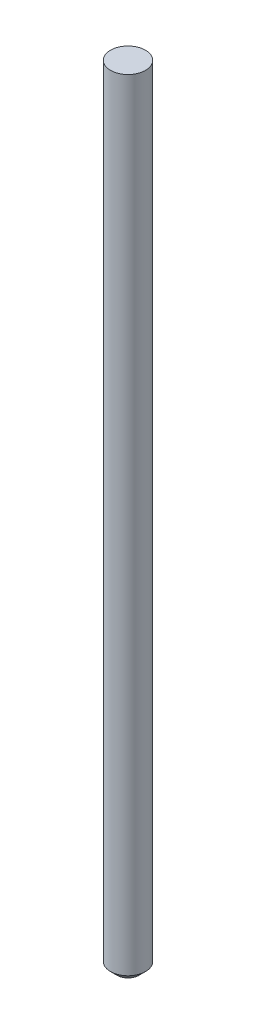
ISO-10303-21;
HEADER;
FILE_DESCRIPTION(('STEP AP214'),'2;1');
FILE_NAME('part.step','',(''),(''),'','','');
FILE_SCHEMA(('AUTOMOTIVE_DESIGN { 1 0 10303 214 1 1 1 1 }'));
ENDSEC;
DATA;
#1=APPLICATION_CONTEXT('core data for automotive mechanical design processes');
#2=APPLICATION_PROTOCOL_DEFINITION('international standard','automotive_design',2000,#1);
#3=PRODUCT_CONTEXT('',#1,'mechanical');
#4=PRODUCT('Part','Part','',(#3));
#5=PRODUCT_RELATED_PRODUCT_CATEGORY('part','',(#4));
#6=PRODUCT_DEFINITION_FORMATION('','',#4);
#7=PRODUCT_DEFINITION_CONTEXT('part definition',#1,'design');
#8=PRODUCT_DEFINITION('design','',#6,#7);
#9=PRODUCT_DEFINITION_SHAPE('','',#8);
#10=(LENGTH_UNIT() NAMED_UNIT(*) SI_UNIT(.MILLI.,.METRE.));
#11=(NAMED_UNIT(*) PLANE_ANGLE_UNIT() SI_UNIT($,.RADIAN.));
#12=(NAMED_UNIT(*) SI_UNIT($,.STERADIAN.) SOLID_ANGLE_UNIT());
#13=UNCERTAINTY_MEASURE_WITH_UNIT(LENGTH_MEASURE(1.E-05),#10,'distance_accuracy_value','');
#14=(GEOMETRIC_REPRESENTATION_CONTEXT(3) GLOBAL_UNCERTAINTY_ASSIGNED_CONTEXT((#13)) GLOBAL_UNIT_ASSIGNED_CONTEXT((#10,
#11,#12)) REPRESENTATION_CONTEXT('',''));
#15=CARTESIAN_POINT('',(0.,0.,0.));
#16=DIRECTION('',(0.,0.,1.));
#17=DIRECTION('',(1.,0.,0.));
#18=AXIS2_PLACEMENT_3D('',#15,#16,#17);
#19=CARTESIAN_POINT('',(0.,180.,0.));
#20=DIRECTION('',(0.,-1.,0.));
#21=DIRECTION('',(0.,0.,-1.));
#22=AXIS2_PLACEMENT_3D('',#19,#20,#21);
#23=CYLINDRICAL_SURFACE('',#22,4.);
#24=CARTESIAN_POINT('',(0.,1.50000000000008,0.));
#25=DIRECTION('',(0.,1.,0.));
#26=DIRECTION('',(0.,0.,1.));
#27=AXIS2_PLACEMENT_3D('',#24,#25,#26);
#28=CIRCLE('',#27,4.);
#29=CARTESIAN_POINT('',(0.,1.50000000000008,-4.));
#30=VERTEX_POINT('',#29);
#31=EDGE_CURVE('E38',#30,#30,#28,.T.);
#32=CARTESIAN_POINT('',(0.,180.,0.));
#33=DIRECTION('',(0.,1.,0.));
#34=DIRECTION('',(0.,0.,1.));
#35=AXIS2_PLACEMENT_3D('',#32,#33,#34);
#36=CIRCLE('',#35,4.);
#37=CARTESIAN_POINT('',(0.,180.,-4.));
#38=VERTEX_POINT('',#37);
#39=EDGE_CURVE('E42',#38,#38,#36,.T.);
#40=CARTESIAN_POINT('',(0.,1.50000000000008,-4.));
#41=CARTESIAN_POINT('',(0.,3.35937500000008,-4.));
#42=CARTESIAN_POINT('',(0.,5.21875000000008,-4.));
#43=CARTESIAN_POINT('',(0.,8.93750000000008,-4.));
#44=CARTESIAN_POINT('',(0.,10.7968750000001,-4.));
#45=CARTESIAN_POINT('',(0.,14.5156250000001,-4.));
#46=CARTESIAN_POINT('',(0.,16.3750000000001,-4.));
#47=CARTESIAN_POINT('',(0.,20.0937500000001,-4.));
#48=CARTESIAN_POINT('',(0.,21.9531250000001,-4.));
#49=CARTESIAN_POINT('',(0.,25.6718750000001,-4.));
#50=CARTESIAN_POINT('',(0.,27.5312500000001,-4.));
#51=CARTESIAN_POINT('',(0.,31.2500000000001,-4.));
#52=CARTESIAN_POINT('',(0.,33.1093750000001,-4.));
#53=CARTESIAN_POINT('',(0.,36.8281250000001,-4.));
#54=CARTESIAN_POINT('',(0.,38.6875000000001,-4.));
#55=CARTESIAN_POINT('',(0.,42.4062500000001,-4.));
#56=CARTESIAN_POINT('',(0.,44.2656250000001,-4.));
#57=CARTESIAN_POINT('',(0.,47.984375,-4.));
#58=CARTESIAN_POINT('',(0.,49.84375,-4.));
#59=CARTESIAN_POINT('',(0.,53.5625,-4.));
#60=CARTESIAN_POINT('',(0.,55.421875,-4.));
#61=CARTESIAN_POINT('',(0.,59.140625,-4.));
#62=CARTESIAN_POINT('',(0.,61.,-4.));
#63=CARTESIAN_POINT('',(0.,64.71875,-4.));
#64=CARTESIAN_POINT('',(0.,66.578125,-4.));
#65=CARTESIAN_POINT('',(0.,70.296875,-4.));
#66=CARTESIAN_POINT('',(0.,72.15625,-4.));
#67=CARTESIAN_POINT('',(0.,75.875,-4.));
#68=CARTESIAN_POINT('',(0.,77.734375,-4.));
#69=CARTESIAN_POINT('',(0.,81.453125,-4.));
#70=CARTESIAN_POINT('',(0.,83.3125,-4.));
#71=CARTESIAN_POINT('',(0.,87.03125,-4.));
#72=CARTESIAN_POINT('',(0.,88.890625,-4.));
#73=CARTESIAN_POINT('',(0.,92.609375,-4.));
#74=CARTESIAN_POINT('',(0.,94.46875,-4.));
#75=CARTESIAN_POINT('',(0.,98.1875,-4.));
#76=CARTESIAN_POINT('',(0.,100.046875,-4.));
#77=CARTESIAN_POINT('',(0.,103.765625,-4.));
#78=CARTESIAN_POINT('',(0.,105.625,-4.));
#79=CARTESIAN_POINT('',(0.,109.34375,-4.));
#80=CARTESIAN_POINT('',(0.,111.203125,-4.));
#81=CARTESIAN_POINT('',(0.,114.921875,-4.));
#82=CARTESIAN_POINT('',(0.,116.78125,-4.));
#83=CARTESIAN_POINT('',(0.,120.5,-4.));
#84=CARTESIAN_POINT('',(0.,122.359375,-4.));
#85=CARTESIAN_POINT('',(0.,126.078125,-4.));
#86=CARTESIAN_POINT('',(0.,127.9375,-4.));
#87=CARTESIAN_POINT('',(0.,131.65625,-4.));
#88=CARTESIAN_POINT('',(0.,133.515625,-4.));
#89=CARTESIAN_POINT('',(0.,137.234375,-4.));
#90=CARTESIAN_POINT('',(0.,139.09375,-4.));
#91=CARTESIAN_POINT('',(0.,142.8125,-4.));
#92=CARTESIAN_POINT('',(0.,144.671875,-4.));
#93=CARTESIAN_POINT('',(0.,148.390625,-4.));
#94=CARTESIAN_POINT('',(0.,150.25,-4.));
#95=CARTESIAN_POINT('',(0.,153.96875,-4.));
#96=CARTESIAN_POINT('',(0.,155.828125,-4.));
#97=CARTESIAN_POINT('',(0.,159.546875,-4.));
#98=CARTESIAN_POINT('',(0.,161.40625,-4.));
#99=CARTESIAN_POINT('',(0.,165.125,-4.));
#100=CARTESIAN_POINT('',(0.,166.984375,-4.));
#101=CARTESIAN_POINT('',(0.,170.703125,-4.));
#102=CARTESIAN_POINT('',(0.,172.5625,-4.));
#103=CARTESIAN_POINT('',(0.,176.28125,-4.));
#104=CARTESIAN_POINT('',(0.,178.140625,-4.));
#105=CARTESIAN_POINT('',(0.,180.,-4.));
#106=B_SPLINE_CURVE_WITH_KNOTS('',3,(#40,#41,#42,#43,#44,#45,#46,#47,#48,#49,#50,#51,#52,#53,
#54,#55,#56,#57,#58,#59,#60,#61,#62,#63,#64,#65,#66,#67,#68,#69,#70,#71,#72,#73,#74,#75,#76,#77,
#78,#79,#80,#81,#82,#83,#84,#85,#86,#87,#88,#89,#90,#91,#92,#93,#94,#95,#96,#97,#98,#99,#100,
#101,#102,#103,#104,#105),.UNSPECIFIED.,.F.,.F.,(4,2,2,2,2,2,2,2,2,2,2,2,2,2,2,2,2,2,2,2,2,2,2,
2,2,2,2,2,2,2,2,2,4),(0.,5.57812499999999,11.15625,16.734375,22.3125,27.890625,33.46875,
39.046875,44.625,50.203125,55.78125,61.359375,66.9375,72.5156249999999,78.0937499999999,
83.6718749999999,89.2499999999999,94.8281249999999,100.40625,105.984375,111.5625,117.140625,
122.71875,128.296875,133.875,139.453125,145.03125,150.609375,156.1875,161.765625,167.34375,
172.921875,178.5),.UNSPECIFIED.);
#107=EDGE_CURVE('BSEAM31',#30,#38,#106,.T.);
#108=ORIENTED_EDGE('',*,*,#31,.T.);
#109=ORIENTED_EDGE('',*,*,#39,.F.);
#110=ORIENTED_EDGE('',*,*,#107,.T.);
#111=ORIENTED_EDGE('',*,*,#107,.F.);
#112=EDGE_LOOP('',(#108,#110,#109,#111));
#113=FACE_BOUND('',#112,.T.);
#114=ADVANCED_FACE('F31',(#113),#23,.T.);
#115=CARTESIAN_POINT('',(0.,180.,0.));
#116=DIRECTION('',(0.,1.,0.));
#117=DIRECTION('',(0.,0.,1.));
#118=AXIS2_PLACEMENT_3D('',#115,#116,#117);
#119=PLANE('',#118);
#120=ORIENTED_EDGE('',*,*,#39,.T.);
#121=EDGE_LOOP('',(#120));
#122=FACE_BOUND('',#121,.T.);
#123=ADVANCED_FACE('F49',(#122),#119,.T.);
#124=CARTESIAN_POINT('',(0.,0.,0.));
#125=DIRECTION('',(0.,1.,0.));
#126=DIRECTION('',(0.,0.,1.));
#127=AXIS2_PLACEMENT_3D('',#124,#125,#126);
#128=PLANE('',#127);
#129=CARTESIAN_POINT('',(0.,0.,0.));
#130=DIRECTION('',(0.,1.,0.));
#131=DIRECTION('',(0.,0.,1.));
#132=AXIS2_PLACEMENT_3D('',#129,#130,#131);
#133=CIRCLE('',#132,2.49999999999989);
#134=CARTESIAN_POINT('',(0.,0.,2.49999999999989));
#135=VERTEX_POINT('',#134);
#136=EDGE_CURVE('E10',#135,#135,#133,.F.);
#137=ORIENTED_EDGE('',*,*,#136,.T.);
#138=EDGE_LOOP('',(#137));
#139=FACE_BOUND('',#138,.T.);
#140=ADVANCED_FACE('F57',(#139),#128,.F.);
#141=CARTESIAN_POINT('',(0.,1.50000000000008,0.));
#142=DIRECTION('',(0.,1.,0.));
#143=DIRECTION('',(0.,0.,1.));
#144=AXIS2_PLACEMENT_3D('',#141,#142,#143);
#145=CONICAL_SURFACE('',#144,4.,0.785398163397457);
#146=ORIENTED_EDGE('',*,*,#136,.F.);
#147=EDGE_LOOP('',(#146));
#148=FACE_BOUND('',#147,.T.);
#149=ORIENTED_EDGE('',*,*,#31,.F.);
#150=EDGE_LOOP('',(#149));
#151=FACE_BOUND('',#150,.T.);
#152=ADVANCED_FACE('F33',(#148,#151),#145,.T.);
#153=CLOSED_SHELL('',(#114,#123,#140,#152));
#154=MANIFOLD_SOLID_BREP('B2',#153);
#155=ADVANCED_BREP_SHAPE_REPRESENTATION('',(#18,#154),#14);
#156=SHAPE_DEFINITION_REPRESENTATION(#9,#155);
ENDSEC;
END-ISO-10303-21;
